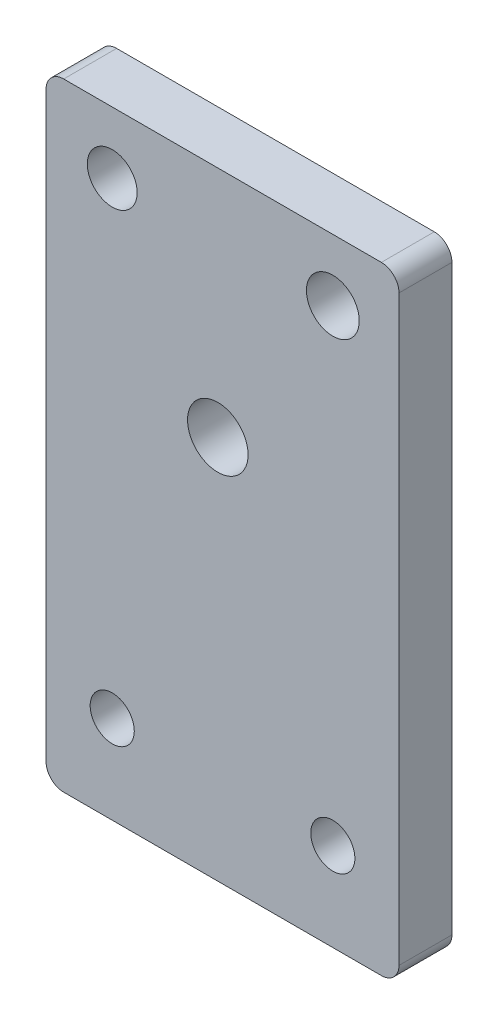
ISO-10303-21;
HEADER;
FILE_DESCRIPTION(('STEP AP214'),'2;1');
FILE_NAME('part.step','',(''),(''),'','','');
FILE_SCHEMA(('AUTOMOTIVE_DESIGN { 1 0 10303 214 1 1 1 1 }'));
ENDSEC;
DATA;
#1=APPLICATION_CONTEXT('core data for automotive mechanical design processes');
#2=APPLICATION_PROTOCOL_DEFINITION('international standard','automotive_design',2000,#1);
#3=PRODUCT_CONTEXT('',#1,'mechanical');
#4=PRODUCT('Part','Part','',(#3));
#5=PRODUCT_RELATED_PRODUCT_CATEGORY('part','',(#4));
#6=PRODUCT_DEFINITION_FORMATION('','',#4);
#7=PRODUCT_DEFINITION_CONTEXT('part definition',#1,'design');
#8=PRODUCT_DEFINITION('design','',#6,#7);
#9=PRODUCT_DEFINITION_SHAPE('','',#8);
#10=(LENGTH_UNIT() NAMED_UNIT(*) SI_UNIT(.MILLI.,.METRE.));
#11=(NAMED_UNIT(*) PLANE_ANGLE_UNIT() SI_UNIT($,.RADIAN.));
#12=(NAMED_UNIT(*) SI_UNIT($,.STERADIAN.) SOLID_ANGLE_UNIT());
#13=UNCERTAINTY_MEASURE_WITH_UNIT(LENGTH_MEASURE(1.E-05),#10,'distance_accuracy_value','');
#14=(GEOMETRIC_REPRESENTATION_CONTEXT(3) GLOBAL_UNCERTAINTY_ASSIGNED_CONTEXT((#13)) GLOBAL_UNIT_ASSIGNED_CONTEXT((#10,
#11,#12)) REPRESENTATION_CONTEXT('',''));
#15=CARTESIAN_POINT('',(0.,0.,0.));
#16=DIRECTION('',(0.,0.,1.));
#17=DIRECTION('',(1.,0.,0.));
#18=AXIS2_PLACEMENT_3D('',#15,#16,#17);
#19=CARTESIAN_POINT('',(-7.93788819875774,-49.7391304347826,6.));
#20=DIRECTION('',(0.,0.,1.));
#21=DIRECTION('',(1.,0.,0.));
#22=AXIS2_PLACEMENT_3D('',#19,#20,#21);
#23=PLANE('',#22);
#24=CARTESIAN_POINT('',(22.5621118012423,-41.7391304347826,6.));
#25=DIRECTION('',(0.,0.,1.));
#26=DIRECTION('',(1.,0.,0.));
#27=AXIS2_PLACEMENT_3D('',#24,#25,#26);
#28=CIRCLE('',#27,2.5);
#29=CARTESIAN_POINT('',(25.0621118012423,-41.7391304347826,6.));
#30=VERTEX_POINT('',#29);
#31=EDGE_CURVE('E199',#30,#30,#28,.T.);
#32=ORIENTED_EDGE('',*,*,#31,.F.);
#33=EDGE_LOOP('',(#32));
#34=FACE_BOUND('',#33,.T.);
#35=CARTESIAN_POINT('',(22.5621118012422,11.2608695652174,6.));
#36=DIRECTION('',(0.,0.,1.));
#37=DIRECTION('',(1.,0.,0.));
#38=AXIS2_PLACEMENT_3D('',#35,#36,#37);
#39=CIRCLE('',#38,2.99254983253616);
#40=CARTESIAN_POINT('',(25.5546616337784,11.2608695652174,6.));
#41=VERTEX_POINT('',#40);
#42=EDGE_CURVE('E187',#41,#41,#39,.T.);
#43=ORIENTED_EDGE('',*,*,#42,.F.);
#44=EDGE_LOOP('',(#43));
#45=FACE_BOUND('',#44,.T.);
#46=CARTESIAN_POINT('',(-7.93788819875774,-49.7391304347826,6.));
#47=DIRECTION('',(0.,0.,1.));
#48=DIRECTION('',(1.,0.,0.));
#49=AXIS2_PLACEMENT_3D('',#46,#47,#48);
#50=CIRCLE('',#49,2.);
#51=CARTESIAN_POINT('',(-9.93788819875774,-49.7391304347826,6.));
#52=VERTEX_POINT('',#51);
#53=CARTESIAN_POINT('',(-7.93788819875773,-51.7391304347826,6.));
#54=VERTEX_POINT('',#53);
#55=EDGE_CURVE('E150',#52,#54,#50,.T.);
#56=ORIENTED_EDGE('',*,*,#55,.T.);
#57=DIRECTION('',(1.,0.,0.));
#58=VECTOR('',#57,1.);
#59=CARTESIAN_POINT('',(-7.93788819875773,-51.7391304347826,6.));
#60=LINE('',#59,#58);
#61=CARTESIAN_POINT('',(28.0621118012422,-51.7391304347826,6.));
#62=VERTEX_POINT('',#61);
#63=EDGE_CURVE('E98',#54,#62,#60,.T.);
#64=ORIENTED_EDGE('',*,*,#63,.T.);
#65=CARTESIAN_POINT('',(28.0621118012423,-49.7391304347826,6.));
#66=DIRECTION('',(0.,0.,1.));
#67=DIRECTION('',(1.,0.,0.));
#68=AXIS2_PLACEMENT_3D('',#65,#66,#67);
#69=CIRCLE('',#68,2.);
#70=CARTESIAN_POINT('',(30.0621118012423,-49.7391304347826,6.));
#71=VERTEX_POINT('',#70);
#72=EDGE_CURVE('E165',#62,#71,#69,.T.);
#73=ORIENTED_EDGE('',*,*,#72,.T.);
#74=DIRECTION('',(0.,1.,0.));
#75=VECTOR('',#74,1.);
#76=CARTESIAN_POINT('',(30.0621118012422,16.2608695652174,6.));
#77=LINE('',#76,#75);
#78=CARTESIAN_POINT('',(30.0621118012422,16.2608695652174,6.));
#79=VERTEX_POINT('',#78);
#80=EDGE_CURVE('E178',#71,#79,#77,.T.);
#81=ORIENTED_EDGE('',*,*,#80,.T.);
#82=CARTESIAN_POINT('',(28.0621118012422,16.2608695652174,6.));
#83=DIRECTION('',(0.,0.,1.));
#84=DIRECTION('',(-1.,0.,0.));
#85=AXIS2_PLACEMENT_3D('',#82,#83,#84);
#86=CIRCLE('',#85,2.);
#87=CARTESIAN_POINT('',(28.0621118012422,18.2608695652174,6.));
#88=VERTEX_POINT('',#87);
#89=EDGE_CURVE('E117',#79,#88,#86,.T.);
#90=ORIENTED_EDGE('',*,*,#89,.T.);
#91=DIRECTION('',(-1.,0.,0.));
#92=VECTOR('',#91,1.);
#93=CARTESIAN_POINT('',(-7.93788819875774,18.2608695652174,6.));
#94=LINE('',#93,#92);
#95=CARTESIAN_POINT('',(-7.93788819875774,18.2608695652174,6.));
#96=VERTEX_POINT('',#95);
#97=EDGE_CURVE('E111',#88,#96,#94,.T.);
#98=ORIENTED_EDGE('',*,*,#97,.T.);
#99=CARTESIAN_POINT('',(-7.93788819875775,16.2608695652174,6.));
#100=DIRECTION('',(0.,0.,1.));
#101=DIRECTION('',(1.,0.,0.));
#102=AXIS2_PLACEMENT_3D('',#99,#100,#101);
#103=CIRCLE('',#102,2.);
#104=CARTESIAN_POINT('',(-9.93788819875775,16.2608695652174,6.));
#105=VERTEX_POINT('',#104);
#106=EDGE_CURVE('E115',#96,#105,#103,.T.);
#107=ORIENTED_EDGE('',*,*,#106,.T.);
#108=DIRECTION('',(0.,-1.,0.));
#109=VECTOR('',#108,1.);
#110=CARTESIAN_POINT('',(-9.93788819875775,16.2608695652174,6.));
#111=LINE('',#110,#109);
#112=EDGE_CURVE('E55',#105,#52,#111,.T.);
#113=ORIENTED_EDGE('',*,*,#112,.T.);
#114=EDGE_LOOP('',(#56,#64,#73,#81,#90,#98,#107,#113));
#115=FACE_BOUND('',#114,.T.);
#116=CARTESIAN_POINT('',(-2.43788819875775,11.2608695652174,6.));
#117=DIRECTION('',(0.,0.,1.));
#118=DIRECTION('',(1.,0.,0.));
#119=AXIS2_PLACEMENT_3D('',#116,#117,#118);
#120=CIRCLE('',#119,2.82411462401771);
#121=CARTESIAN_POINT('',(0.386226425259959,11.2608695652174,6.));
#122=VERTEX_POINT('',#121);
#123=EDGE_CURVE('E139',#122,#122,#120,.T.);
#124=ORIENTED_EDGE('',*,*,#123,.F.);
#125=EDGE_LOOP('',(#124));
#126=FACE_BOUND('',#125,.T.);
#127=CARTESIAN_POINT('',(-2.43788819875775,-41.7391304347826,6.));
#128=DIRECTION('',(0.,0.,1.));
#129=DIRECTION('',(1.,0.,0.));
#130=AXIS2_PLACEMENT_3D('',#127,#128,#129);
#131=CIRCLE('',#130,2.5);
#132=CARTESIAN_POINT('',(0.0621118012422549,-41.7391304347826,6.));
#133=VERTEX_POINT('',#132);
#134=EDGE_CURVE('E193',#133,#133,#131,.T.);
#135=ORIENTED_EDGE('',*,*,#134,.F.);
#136=EDGE_LOOP('',(#135));
#137=FACE_BOUND('',#136,.T.);
#138=CARTESIAN_POINT('',(9.52591304347827,-8.17662111801243,6.));
#139=DIRECTION('',(0.,0.,1.));
#140=DIRECTION('',(1.,0.,0.));
#141=AXIS2_PLACEMENT_3D('',#138,#139,#140);
#142=CIRCLE('',#141,3.43104668953207);
#143=CARTESIAN_POINT('',(12.9569597330103,-8.17662111801243,6.));
#144=VERTEX_POINT('',#143);
#145=EDGE_CURVE('E205',#144,#144,#142,.T.);
#146=ORIENTED_EDGE('',*,*,#145,.F.);
#147=EDGE_LOOP('',(#146));
#148=FACE_BOUND('',#147,.T.);
#149=ADVANCED_FACE('F38',(#34,#45,#115,#126,#137,#148),#23,.T.);
#150=CARTESIAN_POINT('',(-7.93788819875774,-49.7391304347826,0.));
#151=DIRECTION('',(0.,0.,1.));
#152=DIRECTION('',(1.,0.,0.));
#153=AXIS2_PLACEMENT_3D('',#150,#151,#152);
#154=PLANE('',#153);
#155=CARTESIAN_POINT('',(-7.93788819875774,-49.7391304347826,0.));
#156=DIRECTION('',(0.,0.,1.));
#157=DIRECTION('',(1.,0.,0.));
#158=AXIS2_PLACEMENT_3D('',#155,#156,#157);
#159=CIRCLE('',#158,2.);
#160=CARTESIAN_POINT('',(-9.93788819875774,-49.7391304347826,0.));
#161=VERTEX_POINT('',#160);
#162=CARTESIAN_POINT('',(-7.93788819875773,-51.7391304347826,0.));
#163=VERTEX_POINT('',#162);
#164=EDGE_CURVE('E135',#161,#163,#159,.T.);
#165=ORIENTED_EDGE('',*,*,#164,.F.);
#166=DIRECTION('',(0.,-1.,0.));
#167=VECTOR('',#166,1.);
#168=CARTESIAN_POINT('',(-9.93788819875775,16.2608695652174,0.));
#169=LINE('',#168,#167);
#170=CARTESIAN_POINT('',(-9.93788819875775,16.2608695652174,0.));
#171=VERTEX_POINT('',#170);
#172=EDGE_CURVE('E90',#171,#161,#169,.T.);
#173=ORIENTED_EDGE('',*,*,#172,.F.);
#174=CARTESIAN_POINT('',(-7.93788819875775,16.2608695652174,0.));
#175=DIRECTION('',(0.,0.,1.));
#176=DIRECTION('',(1.,0.,0.));
#177=AXIS2_PLACEMENT_3D('',#174,#175,#176);
#178=CIRCLE('',#177,2.);
#179=CARTESIAN_POINT('',(-7.93788819875774,18.2608695652174,0.));
#180=VERTEX_POINT('',#179);
#181=EDGE_CURVE('E84',#180,#171,#178,.T.);
#182=ORIENTED_EDGE('',*,*,#181,.F.);
#183=DIRECTION('',(-1.,0.,0.));
#184=VECTOR('',#183,1.);
#185=CARTESIAN_POINT('',(-7.93788819875774,18.2608695652174,0.));
#186=LINE('',#185,#184);
#187=CARTESIAN_POINT('',(28.0621118012422,18.2608695652174,0.));
#188=VERTEX_POINT('',#187);
#189=EDGE_CURVE('E125',#188,#180,#186,.T.);
#190=ORIENTED_EDGE('',*,*,#189,.F.);
#191=CARTESIAN_POINT('',(28.0621118012422,16.2608695652174,0.));
#192=DIRECTION('',(0.,0.,1.));
#193=DIRECTION('',(-1.,0.,0.));
#194=AXIS2_PLACEMENT_3D('',#191,#192,#193);
#195=CIRCLE('',#194,2.);
#196=CARTESIAN_POINT('',(30.0621118012422,16.2608695652174,0.));
#197=VERTEX_POINT('',#196);
#198=EDGE_CURVE('E145',#197,#188,#195,.T.);
#199=ORIENTED_EDGE('',*,*,#198,.F.);
#200=DIRECTION('',(0.,1.,0.));
#201=VECTOR('',#200,1.);
#202=CARTESIAN_POINT('',(30.0621118012422,16.2608695652174,0.));
#203=LINE('',#202,#201);
#204=CARTESIAN_POINT('',(30.0621118012423,-49.7391304347826,0.));
#205=VERTEX_POINT('',#204);
#206=EDGE_CURVE('E143',#205,#197,#203,.T.);
#207=ORIENTED_EDGE('',*,*,#206,.F.);
#208=CARTESIAN_POINT('',(28.0621118012423,-49.7391304347826,0.));
#209=DIRECTION('',(0.,0.,1.));
#210=DIRECTION('',(1.,0.,0.));
#211=AXIS2_PLACEMENT_3D('',#208,#209,#210);
#212=CIRCLE('',#211,2.);
#213=CARTESIAN_POINT('',(28.0621118012422,-51.7391304347826,0.));
#214=VERTEX_POINT('',#213);
#215=EDGE_CURVE('E141',#214,#205,#212,.T.);
#216=ORIENTED_EDGE('',*,*,#215,.F.);
#217=DIRECTION('',(1.,0.,0.));
#218=VECTOR('',#217,1.);
#219=CARTESIAN_POINT('',(-7.93788819875773,-51.7391304347826,0.));
#220=LINE('',#219,#218);
#221=EDGE_CURVE('E138',#163,#214,#220,.T.);
#222=ORIENTED_EDGE('',*,*,#221,.F.);
#223=EDGE_LOOP('',(#165,#173,#182,#190,#199,#207,#216,#222));
#224=FACE_BOUND('',#223,.T.);
#225=CARTESIAN_POINT('',(-2.43788819875775,11.2608695652174,0.));
#226=DIRECTION('',(0.,0.,1.));
#227=DIRECTION('',(1.,0.,0.));
#228=AXIS2_PLACEMENT_3D('',#225,#226,#227);
#229=CIRCLE('',#228,2.82411462401771);
#230=CARTESIAN_POINT('',(0.386226425259959,11.2608695652174,0.));
#231=VERTEX_POINT('',#230);
#232=EDGE_CURVE('E184',#231,#231,#229,.T.);
#233=ORIENTED_EDGE('',*,*,#232,.T.);
#234=EDGE_LOOP('',(#233));
#235=FACE_BOUND('',#234,.T.);
#236=CARTESIAN_POINT('',(22.5621118012422,11.2608695652174,0.));
#237=DIRECTION('',(0.,0.,1.));
#238=DIRECTION('',(1.,0.,0.));
#239=AXIS2_PLACEMENT_3D('',#236,#237,#238);
#240=CIRCLE('',#239,2.99254983253616);
#241=CARTESIAN_POINT('',(25.5546616337784,11.2608695652174,0.));
#242=VERTEX_POINT('',#241);
#243=EDGE_CURVE('E190',#242,#242,#240,.T.);
#244=ORIENTED_EDGE('',*,*,#243,.T.);
#245=EDGE_LOOP('',(#244));
#246=FACE_BOUND('',#245,.T.);
#247=CARTESIAN_POINT('',(-2.43788819875775,-41.7391304347826,0.));
#248=DIRECTION('',(0.,0.,1.));
#249=DIRECTION('',(1.,0.,0.));
#250=AXIS2_PLACEMENT_3D('',#247,#248,#249);
#251=CIRCLE('',#250,2.5);
#252=CARTESIAN_POINT('',(0.0621118012422549,-41.7391304347826,0.));
#253=VERTEX_POINT('',#252);
#254=EDGE_CURVE('E196',#253,#253,#251,.T.);
#255=ORIENTED_EDGE('',*,*,#254,.T.);
#256=EDGE_LOOP('',(#255));
#257=FACE_BOUND('',#256,.T.);
#258=CARTESIAN_POINT('',(22.5621118012423,-41.7391304347826,0.));
#259=DIRECTION('',(0.,0.,1.));
#260=DIRECTION('',(1.,0.,0.));
#261=AXIS2_PLACEMENT_3D('',#258,#259,#260);
#262=CIRCLE('',#261,2.5);
#263=CARTESIAN_POINT('',(25.0621118012423,-41.7391304347826,0.));
#264=VERTEX_POINT('',#263);
#265=EDGE_CURVE('E202',#264,#264,#262,.T.);
#266=ORIENTED_EDGE('',*,*,#265,.T.);
#267=EDGE_LOOP('',(#266));
#268=FACE_BOUND('',#267,.T.);
#269=CARTESIAN_POINT('',(9.52591304347827,-8.17662111801243,0.));
#270=DIRECTION('',(0.,0.,1.));
#271=DIRECTION('',(1.,0.,0.));
#272=AXIS2_PLACEMENT_3D('',#269,#270,#271);
#273=CIRCLE('',#272,3.43104668953207);
#274=CARTESIAN_POINT('',(12.9569597330103,-8.17662111801243,0.));
#275=VERTEX_POINT('',#274);
#276=EDGE_CURVE('E208',#275,#275,#273,.T.);
#277=ORIENTED_EDGE('',*,*,#276,.T.);
#278=EDGE_LOOP('',(#277));
#279=FACE_BOUND('',#278,.T.);
#280=ADVANCED_FACE('F169',(#224,#235,#246,#257,#268,#279),#154,.F.);
#281=CARTESIAN_POINT('',(-7.93788819875774,-49.7391304347826,6.));
#282=DIRECTION('',(0.,0.,-1.));
#283=DIRECTION('',(-1.,0.,0.));
#284=AXIS2_PLACEMENT_3D('',#281,#282,#283);
#285=CYLINDRICAL_SURFACE('',#284,2.);
#286=ORIENTED_EDGE('',*,*,#164,.T.);
#287=DIRECTION('',(0.,0.,-1.));
#288=VECTOR('',#287,1.);
#289=CARTESIAN_POINT('',(-7.93788819875773,-51.7391304347826,6.));
#290=LINE('',#289,#288);
#291=EDGE_CURVE('E11',#54,#163,#290,.T.);
#292=ORIENTED_EDGE('',*,*,#291,.F.);
#293=ORIENTED_EDGE('',*,*,#55,.F.);
#294=DIRECTION('',(0.,0.,-1.));
#295=VECTOR('',#294,1.);
#296=CARTESIAN_POINT('',(-9.93788819875774,-49.7391304347826,6.));
#297=LINE('',#296,#295);
#298=EDGE_CURVE('E131',#52,#161,#297,.T.);
#299=ORIENTED_EDGE('',*,*,#298,.T.);
#300=EDGE_LOOP('',(#286,#292,#293,#299));
#301=FACE_BOUND('',#300,.T.);
#302=ADVANCED_FACE('F40',(#301),#285,.T.);
#303=CARTESIAN_POINT('',(-7.93788819875773,-51.7391304347826,6.));
#304=DIRECTION('',(0.,1.,0.));
#305=DIRECTION('',(0.,0.,1.));
#306=AXIS2_PLACEMENT_3D('',#303,#304,#305);
#307=PLANE('',#306);
#308=ORIENTED_EDGE('',*,*,#221,.T.);
#309=DIRECTION('',(0.,0.,-1.));
#310=VECTOR('',#309,1.);
#311=CARTESIAN_POINT('',(28.0621118012422,-51.7391304347826,6.));
#312=LINE('',#311,#310);
#313=EDGE_CURVE('E47',#62,#214,#312,.T.);
#314=ORIENTED_EDGE('',*,*,#313,.F.);
#315=ORIENTED_EDGE('',*,*,#63,.F.);
#316=ORIENTED_EDGE('',*,*,#291,.T.);
#317=EDGE_LOOP('',(#308,#314,#315,#316));
#318=FACE_BOUND('',#317,.T.);
#319=ADVANCED_FACE('F242',(#318),#307,.F.);
#320=CARTESIAN_POINT('',(28.0621118012423,-49.7391304347826,6.));
#321=DIRECTION('',(0.,0.,-1.));
#322=DIRECTION('',(-1.,0.,0.));
#323=AXIS2_PLACEMENT_3D('',#320,#321,#322);
#324=CYLINDRICAL_SURFACE('',#323,2.);
#325=ORIENTED_EDGE('',*,*,#215,.T.);
#326=DIRECTION('',(0.,0.,-1.));
#327=VECTOR('',#326,1.);
#328=CARTESIAN_POINT('',(30.0621118012423,-49.7391304347826,6.));
#329=LINE('',#328,#327);
#330=EDGE_CURVE('E157',#71,#205,#329,.T.);
#331=ORIENTED_EDGE('',*,*,#330,.F.);
#332=ORIENTED_EDGE('',*,*,#72,.F.);
#333=ORIENTED_EDGE('',*,*,#313,.T.);
#334=EDGE_LOOP('',(#325,#331,#332,#333));
#335=FACE_BOUND('',#334,.T.);
#336=ADVANCED_FACE('F163',(#335),#324,.T.);
#337=CARTESIAN_POINT('',(30.0621118012422,16.2608695652174,6.));
#338=DIRECTION('',(-1.,0.,0.));
#339=DIRECTION('',(0.,-1.,0.));
#340=AXIS2_PLACEMENT_3D('',#337,#338,#339);
#341=PLANE('',#340);
#342=ORIENTED_EDGE('',*,*,#206,.T.);
#343=DIRECTION('',(0.,0.,-1.));
#344=VECTOR('',#343,1.);
#345=CARTESIAN_POINT('',(30.0621118012422,16.2608695652174,6.));
#346=LINE('',#345,#344);
#347=EDGE_CURVE('E154',#79,#197,#346,.T.);
#348=ORIENTED_EDGE('',*,*,#347,.F.);
#349=ORIENTED_EDGE('',*,*,#80,.F.);
#350=ORIENTED_EDGE('',*,*,#330,.T.);
#351=EDGE_LOOP('',(#342,#348,#349,#350));
#352=FACE_BOUND('',#351,.T.);
#353=ADVANCED_FACE('F174',(#352),#341,.F.);
#354=CARTESIAN_POINT('',(28.0621118012422,16.2608695652174,6.));
#355=DIRECTION('',(0.,0.,-1.));
#356=DIRECTION('',(-1.,0.,0.));
#357=AXIS2_PLACEMENT_3D('',#354,#355,#356);
#358=CYLINDRICAL_SURFACE('',#357,2.);
#359=ORIENTED_EDGE('',*,*,#198,.T.);
#360=DIRECTION('',(0.,0.,-1.));
#361=VECTOR('',#360,1.);
#362=CARTESIAN_POINT('',(28.0621118012422,18.2608695652174,6.));
#363=LINE('',#362,#361);
#364=EDGE_CURVE('E126',#88,#188,#363,.T.);
#365=ORIENTED_EDGE('',*,*,#364,.F.);
#366=ORIENTED_EDGE('',*,*,#89,.F.);
#367=ORIENTED_EDGE('',*,*,#347,.T.);
#368=EDGE_LOOP('',(#359,#365,#366,#367));
#369=FACE_BOUND('',#368,.T.);
#370=ADVANCED_FACE('F177',(#369),#358,.T.);
#371=CARTESIAN_POINT('',(-7.93788819875774,18.2608695652174,6.));
#372=DIRECTION('',(0.,-1.,0.));
#373=DIRECTION('',(0.,0.,-1.));
#374=AXIS2_PLACEMENT_3D('',#371,#372,#373);
#375=PLANE('',#374);
#376=ORIENTED_EDGE('',*,*,#189,.T.);
#377=DIRECTION('',(0.,0.,-1.));
#378=VECTOR('',#377,1.);
#379=CARTESIAN_POINT('',(-7.93788819875774,18.2608695652174,6.));
#380=LINE('',#379,#378);
#381=EDGE_CURVE('E122',#96,#180,#380,.T.);
#382=ORIENTED_EDGE('',*,*,#381,.F.);
#383=ORIENTED_EDGE('',*,*,#97,.F.);
#384=ORIENTED_EDGE('',*,*,#364,.T.);
#385=EDGE_LOOP('',(#376,#382,#383,#384));
#386=FACE_BOUND('',#385,.T.);
#387=ADVANCED_FACE('F123',(#386),#375,.F.);
#388=CARTESIAN_POINT('',(-7.93788819875775,16.2608695652174,6.));
#389=DIRECTION('',(0.,0.,-1.));
#390=DIRECTION('',(-1.,0.,0.));
#391=AXIS2_PLACEMENT_3D('',#388,#389,#390);
#392=CYLINDRICAL_SURFACE('',#391,2.);
#393=ORIENTED_EDGE('',*,*,#181,.T.);
#394=DIRECTION('',(0.,0.,-1.));
#395=VECTOR('',#394,1.);
#396=CARTESIAN_POINT('',(-9.93788819875775,16.2608695652174,6.));
#397=LINE('',#396,#395);
#398=EDGE_CURVE('E127',#105,#171,#397,.T.);
#399=ORIENTED_EDGE('',*,*,#398,.F.);
#400=ORIENTED_EDGE('',*,*,#106,.F.);
#401=ORIENTED_EDGE('',*,*,#381,.T.);
#402=EDGE_LOOP('',(#393,#399,#400,#401));
#403=FACE_BOUND('',#402,.T.);
#404=ADVANCED_FACE('F129',(#403),#392,.T.);
#405=CARTESIAN_POINT('',(-9.93788819875775,16.2608695652174,6.));
#406=DIRECTION('',(1.,0.,0.));
#407=DIRECTION('',(0.,1.,0.));
#408=AXIS2_PLACEMENT_3D('',#405,#406,#407);
#409=PLANE('',#408);
#410=ORIENTED_EDGE('',*,*,#172,.T.);
#411=ORIENTED_EDGE('',*,*,#298,.F.);
#412=ORIENTED_EDGE('',*,*,#112,.F.);
#413=ORIENTED_EDGE('',*,*,#398,.T.);
#414=EDGE_LOOP('',(#410,#411,#412,#413));
#415=FACE_BOUND('',#414,.T.);
#416=ADVANCED_FACE('F230',(#415),#409,.F.);
#417=CARTESIAN_POINT('',(-2.43788819875775,11.2608695652174,6.));
#418=DIRECTION('',(0.,0.,-1.));
#419=DIRECTION('',(-1.,0.,0.));
#420=AXIS2_PLACEMENT_3D('',#417,#418,#419);
#421=CYLINDRICAL_SURFACE('',#420,2.82411462401771);
#422=ORIENTED_EDGE('',*,*,#123,.T.);
#423=EDGE_LOOP('',(#422));
#424=FACE_BOUND('',#423,.T.);
#425=ORIENTED_EDGE('',*,*,#232,.F.);
#426=EDGE_LOOP('',(#425));
#427=FACE_BOUND('',#426,.T.);
#428=ADVANCED_FACE('F227',(#424,#427),#421,.F.);
#429=CARTESIAN_POINT('',(22.5621118012422,11.2608695652174,6.));
#430=DIRECTION('',(0.,0.,-1.));
#431=DIRECTION('',(-1.,0.,0.));
#432=AXIS2_PLACEMENT_3D('',#429,#430,#431);
#433=CYLINDRICAL_SURFACE('',#432,2.99254983253616);
#434=ORIENTED_EDGE('',*,*,#42,.T.);
#435=EDGE_LOOP('',(#434));
#436=FACE_BOUND('',#435,.T.);
#437=ORIENTED_EDGE('',*,*,#243,.F.);
#438=EDGE_LOOP('',(#437));
#439=FACE_BOUND('',#438,.T.);
#440=ADVANCED_FACE('F318',(#436,#439),#433,.F.);
#441=CARTESIAN_POINT('',(-2.43788819875775,-41.7391304347826,6.));
#442=DIRECTION('',(0.,0.,-1.));
#443=DIRECTION('',(-1.,0.,0.));
#444=AXIS2_PLACEMENT_3D('',#441,#442,#443);
#445=CYLINDRICAL_SURFACE('',#444,2.5);
#446=ORIENTED_EDGE('',*,*,#134,.T.);
#447=EDGE_LOOP('',(#446));
#448=FACE_BOUND('',#447,.T.);
#449=ORIENTED_EDGE('',*,*,#254,.F.);
#450=EDGE_LOOP('',(#449));
#451=FACE_BOUND('',#450,.T.);
#452=ADVANCED_FACE('F327',(#448,#451),#445,.F.);
#453=CARTESIAN_POINT('',(22.5621118012423,-41.7391304347826,6.));
#454=DIRECTION('',(0.,0.,-1.));
#455=DIRECTION('',(-1.,0.,0.));
#456=AXIS2_PLACEMENT_3D('',#453,#454,#455);
#457=CYLINDRICAL_SURFACE('',#456,2.5);
#458=ORIENTED_EDGE('',*,*,#31,.T.);
#459=EDGE_LOOP('',(#458));
#460=FACE_BOUND('',#459,.T.);
#461=ORIENTED_EDGE('',*,*,#265,.F.);
#462=EDGE_LOOP('',(#461));
#463=FACE_BOUND('',#462,.T.);
#464=ADVANCED_FACE('F336',(#460,#463),#457,.F.);
#465=CARTESIAN_POINT('',(9.52591304347827,-8.17662111801243,6.));
#466=DIRECTION('',(0.,0.,-1.));
#467=DIRECTION('',(-1.,0.,0.));
#468=AXIS2_PLACEMENT_3D('',#465,#466,#467);
#469=CYLINDRICAL_SURFACE('',#468,3.43104668953207);
#470=ORIENTED_EDGE('',*,*,#145,.T.);
#471=EDGE_LOOP('',(#470));
#472=FACE_BOUND('',#471,.T.);
#473=ORIENTED_EDGE('',*,*,#276,.F.);
#474=EDGE_LOOP('',(#473));
#475=FACE_BOUND('',#474,.T.);
#476=ADVANCED_FACE('F214',(#472,#475),#469,.F.);
#477=CLOSED_SHELL('',(#149,#280,#302,#319,#336,#353,#370,#387,#404,#416,#428,#440,#452,#464,#476));
#478=MANIFOLD_SOLID_BREP('B2',#477);
#479=ADVANCED_BREP_SHAPE_REPRESENTATION('',(#18,#478),#14);
#480=SHAPE_DEFINITION_REPRESENTATION(#9,#479);
ENDSEC;
END-ISO-10303-21;
